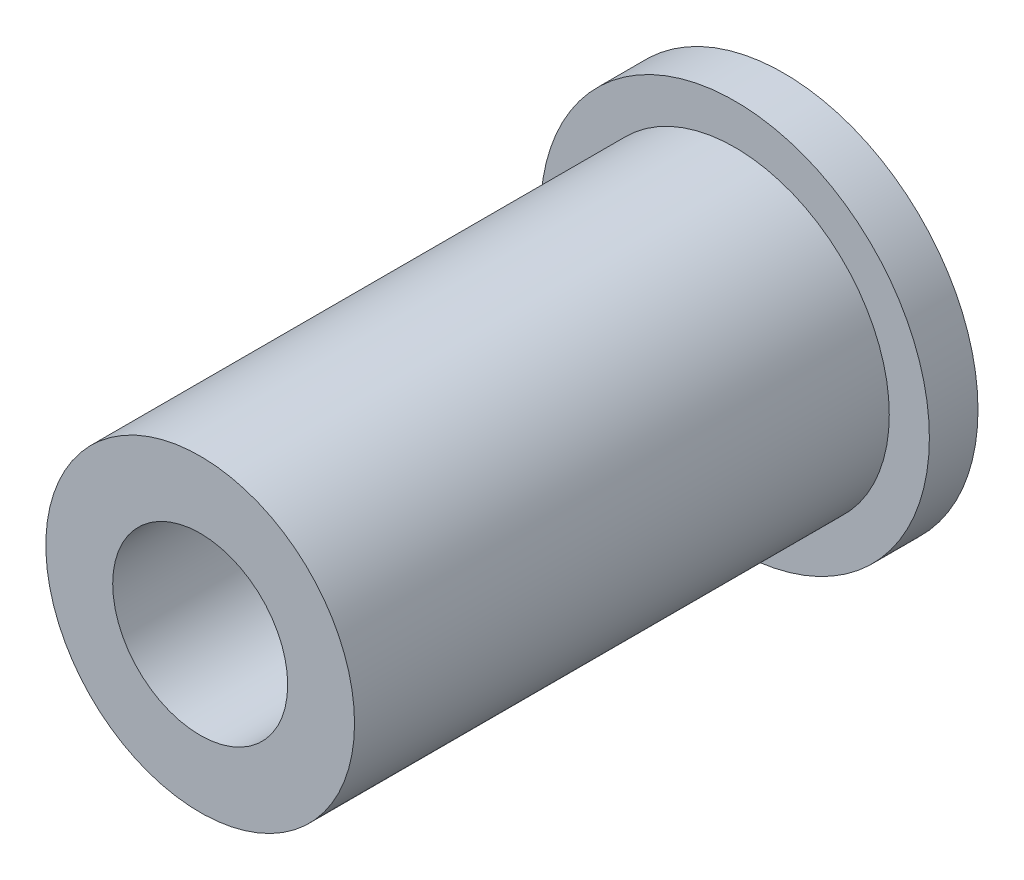
ISO-10303-21;
HEADER;
FILE_DESCRIPTION(('STEP AP214'),'2;1');
FILE_NAME('part.step','',(''),(''),'','','');
FILE_SCHEMA(('AUTOMOTIVE_DESIGN { 1 0 10303 214 1 1 1 1 }'));
ENDSEC;
DATA;
#1=APPLICATION_CONTEXT('core data for automotive mechanical design processes');
#2=APPLICATION_PROTOCOL_DEFINITION('international standard','automotive_design',2000,#1);
#3=PRODUCT_CONTEXT('',#1,'mechanical');
#4=PRODUCT('Part','Part','',(#3));
#5=PRODUCT_RELATED_PRODUCT_CATEGORY('part','',(#4));
#6=PRODUCT_DEFINITION_FORMATION('','',#4);
#7=PRODUCT_DEFINITION_CONTEXT('part definition',#1,'design');
#8=PRODUCT_DEFINITION('design','',#6,#7);
#9=PRODUCT_DEFINITION_SHAPE('','',#8);
#10=(LENGTH_UNIT() NAMED_UNIT(*) SI_UNIT(.MILLI.,.METRE.));
#11=(NAMED_UNIT(*) PLANE_ANGLE_UNIT() SI_UNIT($,.RADIAN.));
#12=(NAMED_UNIT(*) SI_UNIT($,.STERADIAN.) SOLID_ANGLE_UNIT());
#13=UNCERTAINTY_MEASURE_WITH_UNIT(LENGTH_MEASURE(1.E-05),#10,'distance_accuracy_value','');
#14=(GEOMETRIC_REPRESENTATION_CONTEXT(3) GLOBAL_UNCERTAINTY_ASSIGNED_CONTEXT((#13)) GLOBAL_UNIT_ASSIGNED_CONTEXT((#10,
#11,#12)) REPRESENTATION_CONTEXT('',''));
#15=CARTESIAN_POINT('',(0.,0.,0.));
#16=DIRECTION('',(0.,0.,1.));
#17=DIRECTION('',(1.,0.,0.));
#18=AXIS2_PLACEMENT_3D('',#15,#16,#17);
#19=CARTESIAN_POINT('',(0.,0.,12.));
#20=DIRECTION('',(0.,0.,-1.));
#21=DIRECTION('',(-1.,0.,0.));
#22=AXIS2_PLACEMENT_3D('',#19,#20,#21);
#23=CYLINDRICAL_SURFACE('',#22,1.8);
#24=CARTESIAN_POINT('',(0.,0.,12.));
#25=DIRECTION('',(0.,0.,-1.));
#26=DIRECTION('',(-1.,0.,0.));
#27=AXIS2_PLACEMENT_3D('',#24,#25,#26);
#28=CIRCLE('',#27,1.8);
#29=CARTESIAN_POINT('',(-1.8,0.,12.));
#30=VERTEX_POINT('',#29);
#31=EDGE_CURVE('E48',#30,#30,#28,.T.);
#32=ORIENTED_EDGE('',*,*,#31,.F.);
#33=EDGE_LOOP('',(#32));
#34=FACE_BOUND('',#33,.T.);
#35=CARTESIAN_POINT('',(0.,0.,4.5));
#36=DIRECTION('',(0.,0.,-1.));
#37=DIRECTION('',(-1.,0.,0.));
#38=AXIS2_PLACEMENT_3D('',#35,#36,#37);
#39=CIRCLE('',#38,1.8);
#40=CARTESIAN_POINT('',(-1.8,0.,4.5));
#41=VERTEX_POINT('',#40);
#42=EDGE_CURVE('E34',#41,#41,#39,.F.);
#43=ORIENTED_EDGE('',*,*,#42,.F.);
#44=EDGE_LOOP('',(#43));
#45=FACE_BOUND('',#44,.T.);
#46=ADVANCED_FACE('F30',(#34,#45),#23,.F.);
#47=CARTESIAN_POINT('',(0.,0.,12.));
#48=DIRECTION('',(0.,0.,-1.));
#49=DIRECTION('',(-1.,0.,0.));
#50=AXIS2_PLACEMENT_3D('',#47,#48,#49);
#51=CYLINDRICAL_SURFACE('',#50,4.);
#52=CARTESIAN_POINT('',(0.,0.,0.));
#53=DIRECTION('',(0.,0.,1.));
#54=DIRECTION('',(1.,0.,0.));
#55=AXIS2_PLACEMENT_3D('',#52,#53,#54);
#56=CIRCLE('',#55,4.);
#57=CARTESIAN_POINT('',(4.,0.,0.));
#58=VERTEX_POINT('',#57);
#59=EDGE_CURVE('E10',#58,#58,#56,.T.);
#60=ORIENTED_EDGE('',*,*,#59,.T.);
#61=EDGE_LOOP('',(#60));
#62=FACE_BOUND('',#61,.T.);
#63=CARTESIAN_POINT('',(0.,0.,1.));
#64=DIRECTION('',(0.,0.,1.));
#65=DIRECTION('',(1.,0.,0.));
#66=AXIS2_PLACEMENT_3D('',#63,#64,#65);
#67=CIRCLE('',#66,4.);
#68=CARTESIAN_POINT('',(4.,0.,1.));
#69=VERTEX_POINT('',#68);
#70=EDGE_CURVE('E38',#69,#69,#67,.T.);
#71=ORIENTED_EDGE('',*,*,#70,.F.);
#72=EDGE_LOOP('',(#71));
#73=FACE_BOUND('',#72,.T.);
#74=ADVANCED_FACE('F32',(#62,#73),#51,.T.);
#75=CARTESIAN_POINT('',(0.,0.,0.));
#76=DIRECTION('',(0.,0.,1.));
#77=DIRECTION('',(1.,0.,0.));
#78=AXIS2_PLACEMENT_3D('',#75,#76,#77);
#79=PLANE('',#78);
#80=CARTESIAN_POINT('',(0.,0.,0.));
#81=DIRECTION('',(0.,0.,-1.));
#82=DIRECTION('',(-1.,0.,0.));
#83=AXIS2_PLACEMENT_3D('',#80,#81,#82);
#84=CIRCLE('',#83,2.8);
#85=CARTESIAN_POINT('',(-2.8,0.,0.));
#86=VERTEX_POINT('',#85);
#87=EDGE_CURVE('E53',#86,#86,#84,.T.);
#88=ORIENTED_EDGE('',*,*,#87,.F.);
#89=EDGE_LOOP('',(#88));
#90=FACE_BOUND('',#89,.T.);
#91=ORIENTED_EDGE('',*,*,#59,.F.);
#92=EDGE_LOOP('',(#91));
#93=FACE_BOUND('',#92,.T.);
#94=ADVANCED_FACE('F71',(#90,#93),#79,.F.);
#95=CARTESIAN_POINT('',(0.,0.,1.));
#96=DIRECTION('',(0.,0.,1.));
#97=DIRECTION('',(1.,0.,0.));
#98=AXIS2_PLACEMENT_3D('',#95,#96,#97);
#99=PLANE('',#98);
#100=CARTESIAN_POINT('',(0.,0.,1.));
#101=DIRECTION('',(0.,0.,1.));
#102=DIRECTION('',(1.,0.,0.));
#103=AXIS2_PLACEMENT_3D('',#100,#101,#102);
#104=CIRCLE('',#103,3.175);
#105=CARTESIAN_POINT('',(3.175,0.,1.));
#106=VERTEX_POINT('',#105);
#107=EDGE_CURVE('E42',#106,#106,#104,.T.);
#108=ORIENTED_EDGE('',*,*,#107,.F.);
#109=EDGE_LOOP('',(#108));
#110=FACE_BOUND('',#109,.T.);
#111=ORIENTED_EDGE('',*,*,#70,.T.);
#112=EDGE_LOOP('',(#111));
#113=FACE_BOUND('',#112,.T.);
#114=ADVANCED_FACE('F81',(#110,#113),#99,.T.);
#115=CARTESIAN_POINT('',(0.,0.,1.));
#116=DIRECTION('',(0.,0.,1.));
#117=DIRECTION('',(1.,0.,0.));
#118=AXIS2_PLACEMENT_3D('',#115,#116,#117);
#119=CYLINDRICAL_SURFACE('',#118,3.175);
#120=ORIENTED_EDGE('',*,*,#107,.T.);
#121=EDGE_LOOP('',(#120));
#122=FACE_BOUND('',#121,.T.);
#123=CARTESIAN_POINT('',(0.,0.,12.));
#124=DIRECTION('',(0.,0.,1.));
#125=DIRECTION('',(1.,0.,0.));
#126=AXIS2_PLACEMENT_3D('',#123,#124,#125);
#127=CIRCLE('',#126,3.175);
#128=CARTESIAN_POINT('',(3.175,0.,12.));
#129=VERTEX_POINT('',#128);
#130=EDGE_CURVE('E45',#129,#129,#127,.T.);
#131=ORIENTED_EDGE('',*,*,#130,.F.);
#132=EDGE_LOOP('',(#131));
#133=FACE_BOUND('',#132,.T.);
#134=ADVANCED_FACE('F77',(#122,#133),#119,.T.);
#135=CARTESIAN_POINT('',(0.,0.,12.));
#136=DIRECTION('',(0.,0.,1.));
#137=DIRECTION('',(1.,0.,0.));
#138=AXIS2_PLACEMENT_3D('',#135,#136,#137);
#139=PLANE('',#138);
#140=ORIENTED_EDGE('',*,*,#31,.T.);
#141=EDGE_LOOP('',(#140));
#142=FACE_BOUND('',#141,.T.);
#143=ORIENTED_EDGE('',*,*,#130,.T.);
#144=EDGE_LOOP('',(#143));
#145=FACE_BOUND('',#144,.T.);
#146=ADVANCED_FACE('F80',(#142,#145),#139,.T.);
#147=CARTESIAN_POINT('',(0.,0.,4.5));
#148=DIRECTION('',(0.,0.,-1.));
#149=DIRECTION('',(-1.,0.,0.));
#150=AXIS2_PLACEMENT_3D('',#147,#148,#149);
#151=PLANE('',#150);
#152=CARTESIAN_POINT('',(0.,0.,4.5));
#153=DIRECTION('',(0.,0.,-1.));
#154=DIRECTION('',(-1.,0.,0.));
#155=AXIS2_PLACEMENT_3D('',#152,#153,#154);
#156=CIRCLE('',#155,2.8);
#157=CARTESIAN_POINT('',(-2.8,0.,4.5));
#158=VERTEX_POINT('',#157);
#159=EDGE_CURVE('E56',#158,#158,#156,.T.);
#160=ORIENTED_EDGE('',*,*,#159,.T.);
#161=EDGE_LOOP('',(#160));
#162=FACE_BOUND('',#161,.T.);
#163=ORIENTED_EDGE('',*,*,#42,.T.);
#164=EDGE_LOOP('',(#163));
#165=FACE_BOUND('',#164,.T.);
#166=ADVANCED_FACE('F63',(#162,#165),#151,.T.);
#167=CARTESIAN_POINT('',(0.,0.,4.5));
#168=DIRECTION('',(0.,0.,-1.));
#169=DIRECTION('',(-1.,0.,0.));
#170=AXIS2_PLACEMENT_3D('',#167,#168,#169);
#171=CYLINDRICAL_SURFACE('',#170,2.8);
#172=ORIENTED_EDGE('',*,*,#159,.F.);
#173=EDGE_LOOP('',(#172));
#174=FACE_BOUND('',#173,.T.);
#175=ORIENTED_EDGE('',*,*,#87,.T.);
#176=EDGE_LOOP('',(#175));
#177=FACE_BOUND('',#176,.T.);
#178=ADVANCED_FACE('F75',(#174,#177),#171,.F.);
#179=CLOSED_SHELL('',(#46,#74,#94,#114,#134,#146,#166,#178));
#180=MANIFOLD_SOLID_BREP('B2',#179);
#181=ADVANCED_BREP_SHAPE_REPRESENTATION('',(#18,#180),#14);
#182=SHAPE_DEFINITION_REPRESENTATION(#9,#181);
ENDSEC;
END-ISO-10303-21;
